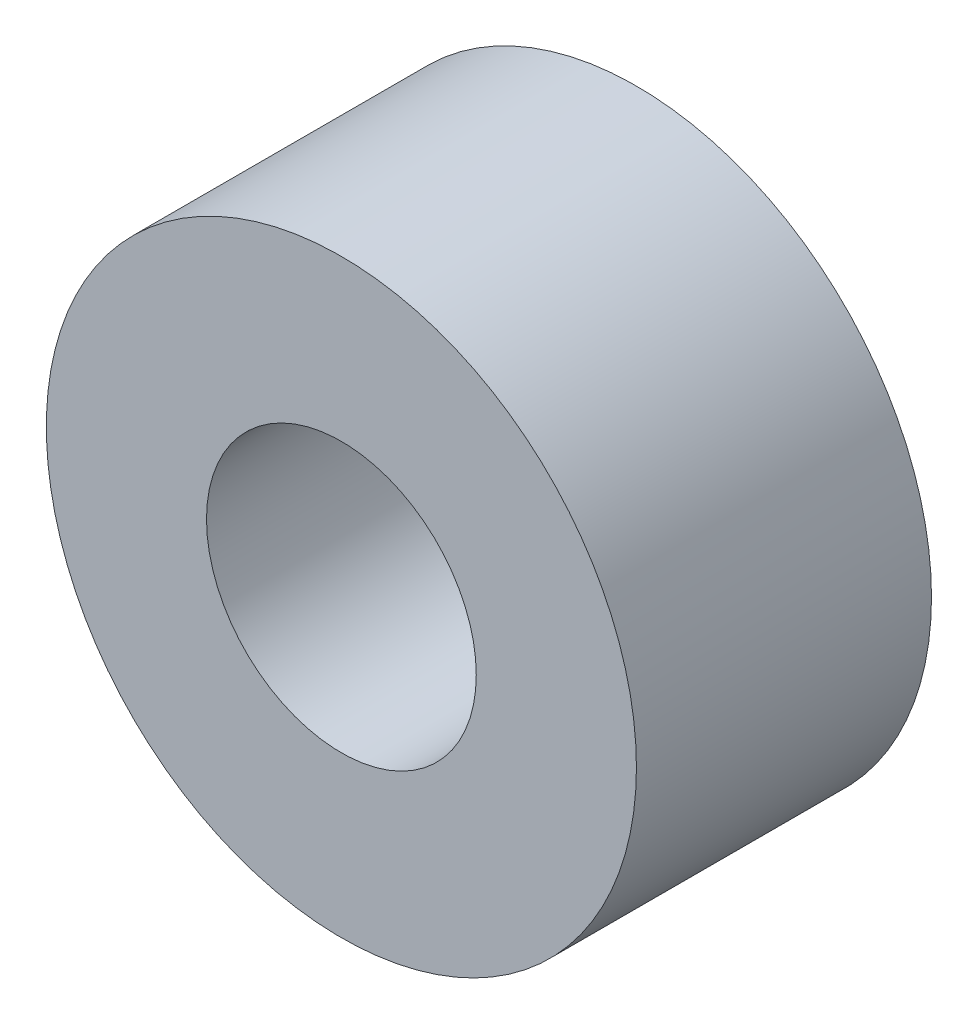
ISO-10303-21;
HEADER;
FILE_DESCRIPTION(('STEP AP214'),'2;1');
FILE_NAME('part.step','',(''),(''),'','','');
FILE_SCHEMA(('AUTOMOTIVE_DESIGN { 1 0 10303 214 1 1 1 1 }'));
ENDSEC;
DATA;
#1=APPLICATION_CONTEXT('core data for automotive mechanical design processes');
#2=APPLICATION_PROTOCOL_DEFINITION('international standard','automotive_design',2000,#1);
#3=PRODUCT_CONTEXT('',#1,'mechanical');
#4=PRODUCT('Part','Part','',(#3));
#5=PRODUCT_RELATED_PRODUCT_CATEGORY('part','',(#4));
#6=PRODUCT_DEFINITION_FORMATION('','',#4);
#7=PRODUCT_DEFINITION_CONTEXT('part definition',#1,'design');
#8=PRODUCT_DEFINITION('design','',#6,#7);
#9=PRODUCT_DEFINITION_SHAPE('','',#8);
#10=(LENGTH_UNIT() NAMED_UNIT(*) SI_UNIT(.MILLI.,.METRE.));
#11=(NAMED_UNIT(*) PLANE_ANGLE_UNIT() SI_UNIT($,.RADIAN.));
#12=(NAMED_UNIT(*) SI_UNIT($,.STERADIAN.) SOLID_ANGLE_UNIT());
#13=UNCERTAINTY_MEASURE_WITH_UNIT(LENGTH_MEASURE(1.E-05),#10,'distance_accuracy_value','');
#14=(GEOMETRIC_REPRESENTATION_CONTEXT(3) GLOBAL_UNCERTAINTY_ASSIGNED_CONTEXT((#13)) GLOBAL_UNIT_ASSIGNED_CONTEXT((#10,
#11,#12)) REPRESENTATION_CONTEXT('',''));
#15=CARTESIAN_POINT('',(0.,0.,0.));
#16=DIRECTION('',(0.,0.,1.));
#17=DIRECTION('',(1.,0.,0.));
#18=AXIS2_PLACEMENT_3D('',#15,#16,#17);
#19=CARTESIAN_POINT('',(0.,0.,3.5));
#20=DIRECTION('',(0.,0.,1.));
#21=DIRECTION('',(1.,0.,0.));
#22=AXIS2_PLACEMENT_3D('',#19,#20,#21);
#23=PLANE('',#22);
#24=CARTESIAN_POINT('',(0.,0.,3.5));
#25=DIRECTION('',(0.,0.,1.));
#26=DIRECTION('',(1.,0.,0.));
#27=AXIS2_PLACEMENT_3D('',#24,#25,#26);
#28=CIRCLE('',#27,3.5);
#29=CARTESIAN_POINT('',(3.5,0.,3.5));
#30=VERTEX_POINT('',#29);
#31=EDGE_CURVE('E10',#30,#30,#28,.T.);
#32=ORIENTED_EDGE('',*,*,#31,.T.);
#33=EDGE_LOOP('',(#32));
#34=FACE_BOUND('',#33,.T.);
#35=CARTESIAN_POINT('',(0.,0.,3.5));
#36=DIRECTION('',(0.,0.,1.));
#37=DIRECTION('',(1.,0.,0.));
#38=AXIS2_PLACEMENT_3D('',#35,#36,#37);
#39=CIRCLE('',#38,1.6);
#40=CARTESIAN_POINT('',(1.6,0.,3.5));
#41=VERTEX_POINT('',#40);
#42=EDGE_CURVE('E42',#41,#41,#39,.T.);
#43=ORIENTED_EDGE('',*,*,#42,.F.);
#44=EDGE_LOOP('',(#43));
#45=FACE_BOUND('',#44,.T.);
#46=ADVANCED_FACE('F31',(#34,#45),#23,.T.);
#47=CARTESIAN_POINT('',(0.,0.,0.));
#48=DIRECTION('',(0.,0.,1.));
#49=DIRECTION('',(1.,0.,0.));
#50=AXIS2_PLACEMENT_3D('',#47,#48,#49);
#51=PLANE('',#50);
#52=CARTESIAN_POINT('',(0.,0.,0.));
#53=DIRECTION('',(0.,0.,1.));
#54=DIRECTION('',(1.,0.,0.));
#55=AXIS2_PLACEMENT_3D('',#52,#53,#54);
#56=CIRCLE('',#55,3.5);
#57=CARTESIAN_POINT('',(3.5,0.,0.));
#58=VERTEX_POINT('',#57);
#59=EDGE_CURVE('E35',#58,#58,#56,.T.);
#60=ORIENTED_EDGE('',*,*,#59,.F.);
#61=EDGE_LOOP('',(#60));
#62=FACE_BOUND('',#61,.T.);
#63=CARTESIAN_POINT('',(0.,0.,0.));
#64=DIRECTION('',(0.,0.,1.));
#65=DIRECTION('',(1.,0.,0.));
#66=AXIS2_PLACEMENT_3D('',#63,#64,#65);
#67=CIRCLE('',#66,1.6);
#68=CARTESIAN_POINT('',(1.6,0.,0.));
#69=VERTEX_POINT('',#68);
#70=EDGE_CURVE('E44',#69,#69,#67,.T.);
#71=ORIENTED_EDGE('',*,*,#70,.T.);
#72=EDGE_LOOP('',(#71));
#73=FACE_BOUND('',#72,.T.);
#74=ADVANCED_FACE('F54',(#62,#73),#51,.F.);
#75=CARTESIAN_POINT('',(0.,0.,3.5));
#76=DIRECTION('',(0.,0.,-1.));
#77=DIRECTION('',(-1.,0.,0.));
#78=AXIS2_PLACEMENT_3D('',#75,#76,#77);
#79=CYLINDRICAL_SURFACE('',#78,3.5);
#80=ORIENTED_EDGE('',*,*,#31,.F.);
#81=EDGE_LOOP('',(#80));
#82=FACE_BOUND('',#81,.T.);
#83=ORIENTED_EDGE('',*,*,#59,.T.);
#84=EDGE_LOOP('',(#83));
#85=FACE_BOUND('',#84,.T.);
#86=ADVANCED_FACE('F33',(#82,#85),#79,.T.);
#87=CARTESIAN_POINT('',(0.,0.,3.5));
#88=DIRECTION('',(0.,0.,-1.));
#89=DIRECTION('',(-1.,0.,0.));
#90=AXIS2_PLACEMENT_3D('',#87,#88,#89);
#91=CYLINDRICAL_SURFACE('',#90,1.6);
#92=ORIENTED_EDGE('',*,*,#42,.T.);
#93=EDGE_LOOP('',(#92));
#94=FACE_BOUND('',#93,.T.);
#95=ORIENTED_EDGE('',*,*,#70,.F.);
#96=EDGE_LOOP('',(#95));
#97=FACE_BOUND('',#96,.T.);
#98=ADVANCED_FACE('F50',(#94,#97),#91,.F.);
#99=CLOSED_SHELL('',(#46,#74,#86,#98));
#100=MANIFOLD_SOLID_BREP('B2',#99);
#101=ADVANCED_BREP_SHAPE_REPRESENTATION('',(#18,#100),#14);
#102=SHAPE_DEFINITION_REPRESENTATION(#9,#101);
ENDSEC;
END-ISO-10303-21;
